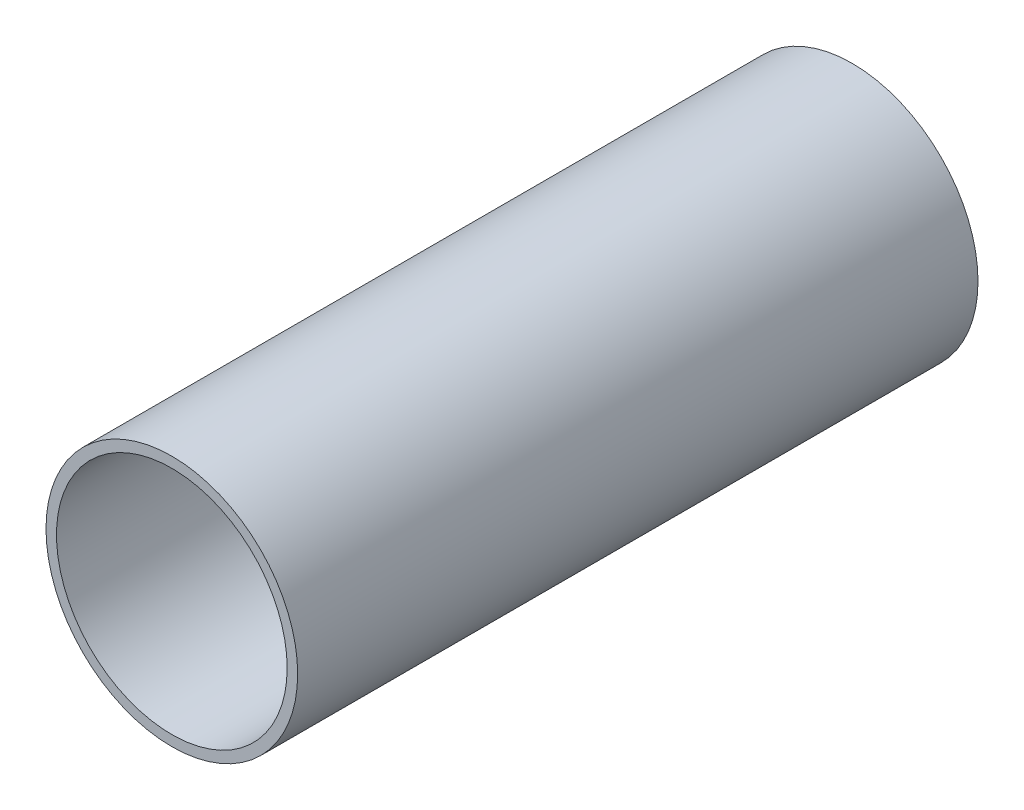
ISO-10303-21;
HEADER;
FILE_DESCRIPTION(('STEP AP214'),'2;1');
FILE_NAME('part.step','',(''),(''),'','','');
FILE_SCHEMA(('AUTOMOTIVE_DESIGN { 1 0 10303 214 1 1 1 1 }'));
ENDSEC;
DATA;
#1=APPLICATION_CONTEXT('core data for automotive mechanical design processes');
#2=APPLICATION_PROTOCOL_DEFINITION('international standard','automotive_design',2000,#1);
#3=PRODUCT_CONTEXT('',#1,'mechanical');
#4=PRODUCT('Part','Part','',(#3));
#5=PRODUCT_RELATED_PRODUCT_CATEGORY('part','',(#4));
#6=PRODUCT_DEFINITION_FORMATION('','',#4);
#7=PRODUCT_DEFINITION_CONTEXT('part definition',#1,'design');
#8=PRODUCT_DEFINITION('design','',#6,#7);
#9=PRODUCT_DEFINITION_SHAPE('','',#8);
#10=(LENGTH_UNIT() NAMED_UNIT(*) SI_UNIT(.MILLI.,.METRE.));
#11=(NAMED_UNIT(*) PLANE_ANGLE_UNIT() SI_UNIT($,.RADIAN.));
#12=(NAMED_UNIT(*) SI_UNIT($,.STERADIAN.) SOLID_ANGLE_UNIT());
#13=UNCERTAINTY_MEASURE_WITH_UNIT(LENGTH_MEASURE(1.E-05),#10,'distance_accuracy_value','');
#14=(GEOMETRIC_REPRESENTATION_CONTEXT(3) GLOBAL_UNCERTAINTY_ASSIGNED_CONTEXT((#13)) GLOBAL_UNIT_ASSIGNED_CONTEXT((#10,
#11,#12)) REPRESENTATION_CONTEXT('',''));
#15=CARTESIAN_POINT('',(0.,0.,0.));
#16=DIRECTION('',(0.,0.,1.));
#17=DIRECTION('',(1.,0.,0.));
#18=AXIS2_PLACEMENT_3D('',#15,#16,#17);
#19=CARTESIAN_POINT('',(0.,0.,412.));
#20=DIRECTION('',(0.,0.,1.));
#21=DIRECTION('',(1.,0.,0.));
#22=AXIS2_PLACEMENT_3D('',#19,#20,#21);
#23=PLANE('',#22);
#24=CARTESIAN_POINT('',(0.,0.,412.));
#25=DIRECTION('',(0.,0.,1.));
#26=DIRECTION('',(1.,0.,0.));
#27=AXIS2_PLACEMENT_3D('',#24,#25,#26);
#28=CIRCLE('',#27,76.2);
#29=CARTESIAN_POINT('',(76.2,0.,412.));
#30=VERTEX_POINT('',#29);
#31=EDGE_CURVE('E10',#30,#30,#28,.T.);
#32=ORIENTED_EDGE('',*,*,#31,.T.);
#33=EDGE_LOOP('',(#32));
#34=FACE_BOUND('',#33,.T.);
#35=CARTESIAN_POINT('',(0.,0.,412.));
#36=DIRECTION('',(0.,0.,1.));
#37=DIRECTION('',(1.,0.,0.));
#38=AXIS2_PLACEMENT_3D('',#35,#36,#37);
#39=CIRCLE('',#38,69.85);
#40=CARTESIAN_POINT('',(69.85,0.,412.));
#41=VERTEX_POINT('',#40);
#42=EDGE_CURVE('E42',#41,#41,#39,.T.);
#43=ORIENTED_EDGE('',*,*,#42,.F.);
#44=EDGE_LOOP('',(#43));
#45=FACE_BOUND('',#44,.T.);
#46=ADVANCED_FACE('F31',(#34,#45),#23,.T.);
#47=CARTESIAN_POINT('',(0.,0.,0.));
#48=DIRECTION('',(0.,0.,1.));
#49=DIRECTION('',(1.,0.,0.));
#50=AXIS2_PLACEMENT_3D('',#47,#48,#49);
#51=PLANE('',#50);
#52=CARTESIAN_POINT('',(0.,0.,0.));
#53=DIRECTION('',(0.,0.,1.));
#54=DIRECTION('',(1.,0.,0.));
#55=AXIS2_PLACEMENT_3D('',#52,#53,#54);
#56=CIRCLE('',#55,76.2);
#57=CARTESIAN_POINT('',(76.2,0.,0.));
#58=VERTEX_POINT('',#57);
#59=EDGE_CURVE('E35',#58,#58,#56,.T.);
#60=ORIENTED_EDGE('',*,*,#59,.F.);
#61=EDGE_LOOP('',(#60));
#62=FACE_BOUND('',#61,.T.);
#63=CARTESIAN_POINT('',(0.,0.,0.));
#64=DIRECTION('',(0.,0.,1.));
#65=DIRECTION('',(1.,0.,0.));
#66=AXIS2_PLACEMENT_3D('',#63,#64,#65);
#67=CIRCLE('',#66,69.85);
#68=CARTESIAN_POINT('',(69.85,0.,0.));
#69=VERTEX_POINT('',#68);
#70=EDGE_CURVE('E44',#69,#69,#67,.T.);
#71=ORIENTED_EDGE('',*,*,#70,.T.);
#72=EDGE_LOOP('',(#71));
#73=FACE_BOUND('',#72,.T.);
#74=ADVANCED_FACE('F54',(#62,#73),#51,.F.);
#75=CARTESIAN_POINT('',(0.,0.,412.));
#76=DIRECTION('',(0.,0.,-1.));
#77=DIRECTION('',(-1.,0.,0.));
#78=AXIS2_PLACEMENT_3D('',#75,#76,#77);
#79=CYLINDRICAL_SURFACE('',#78,76.2);
#80=ORIENTED_EDGE('',*,*,#31,.F.);
#81=EDGE_LOOP('',(#80));
#82=FACE_BOUND('',#81,.T.);
#83=ORIENTED_EDGE('',*,*,#59,.T.);
#84=EDGE_LOOP('',(#83));
#85=FACE_BOUND('',#84,.T.);
#86=ADVANCED_FACE('F33',(#82,#85),#79,.T.);
#87=CARTESIAN_POINT('',(0.,0.,412.));
#88=DIRECTION('',(0.,0.,-1.));
#89=DIRECTION('',(-1.,0.,0.));
#90=AXIS2_PLACEMENT_3D('',#87,#88,#89);
#91=CYLINDRICAL_SURFACE('',#90,69.85);
#92=ORIENTED_EDGE('',*,*,#42,.T.);
#93=EDGE_LOOP('',(#92));
#94=FACE_BOUND('',#93,.T.);
#95=ORIENTED_EDGE('',*,*,#70,.F.);
#96=EDGE_LOOP('',(#95));
#97=FACE_BOUND('',#96,.T.);
#98=ADVANCED_FACE('F50',(#94,#97),#91,.F.);
#99=CLOSED_SHELL('',(#46,#74,#86,#98));
#100=MANIFOLD_SOLID_BREP('B2',#99);
#101=ADVANCED_BREP_SHAPE_REPRESENTATION('',(#18,#100),#14);
#102=SHAPE_DEFINITION_REPRESENTATION(#9,#101);
ENDSEC;
END-ISO-10303-21;
